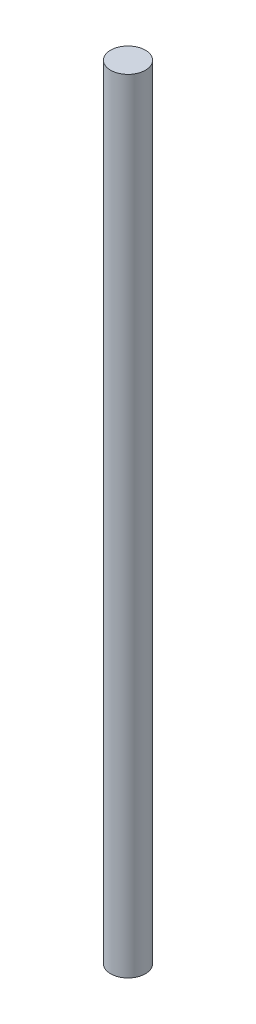
ISO-10303-21;
HEADER;
FILE_DESCRIPTION(('STEP AP214'),'2;1');
FILE_NAME('part.step','',(''),(''),'','','');
FILE_SCHEMA(('AUTOMOTIVE_DESIGN { 1 0 10303 214 1 1 1 1 }'));
ENDSEC;
DATA;
#1=APPLICATION_CONTEXT('core data for automotive mechanical design processes');
#2=APPLICATION_PROTOCOL_DEFINITION('international standard','automotive_design',2000,#1);
#3=PRODUCT_CONTEXT('',#1,'mechanical');
#4=PRODUCT('Part','Part','',(#3));
#5=PRODUCT_RELATED_PRODUCT_CATEGORY('part','',(#4));
#6=PRODUCT_DEFINITION_FORMATION('','',#4);
#7=PRODUCT_DEFINITION_CONTEXT('part definition',#1,'design');
#8=PRODUCT_DEFINITION('design','',#6,#7);
#9=PRODUCT_DEFINITION_SHAPE('','',#8);
#10=(LENGTH_UNIT() NAMED_UNIT(*) SI_UNIT(.MILLI.,.METRE.));
#11=(NAMED_UNIT(*) PLANE_ANGLE_UNIT() SI_UNIT($,.RADIAN.));
#12=(NAMED_UNIT(*) SI_UNIT($,.STERADIAN.) SOLID_ANGLE_UNIT());
#13=UNCERTAINTY_MEASURE_WITH_UNIT(LENGTH_MEASURE(1.E-05),#10,'distance_accuracy_value','');
#14=(GEOMETRIC_REPRESENTATION_CONTEXT(3) GLOBAL_UNCERTAINTY_ASSIGNED_CONTEXT((#13)) GLOBAL_UNIT_ASSIGNED_CONTEXT((#10,
#11,#12)) REPRESENTATION_CONTEXT('',''));
#15=CARTESIAN_POINT('',(0.,0.,0.));
#16=DIRECTION('',(0.,0.,1.));
#17=DIRECTION('',(1.,0.,0.));
#18=AXIS2_PLACEMENT_3D('',#15,#16,#17);
#19=CARTESIAN_POINT('',(0.,45.,0.));
#20=DIRECTION('',(0.,-1.,0.));
#21=DIRECTION('',(0.,0.,-1.));
#22=AXIS2_PLACEMENT_3D('',#19,#20,#21);
#23=CYLINDRICAL_SURFACE('',#22,1.);
#24=CARTESIAN_POINT('',(0.,45.,0.));
#25=DIRECTION('',(0.,1.,0.));
#26=DIRECTION('',(0.,0.,1.));
#27=AXIS2_PLACEMENT_3D('',#24,#25,#26);
#28=CIRCLE('',#27,1.);
#29=CARTESIAN_POINT('',(0.,45.,-1.));
#30=VERTEX_POINT('',#29);
#31=EDGE_CURVE('E10',#30,#30,#28,.T.);
#32=CARTESIAN_POINT('',(0.,0.,0.));
#33=DIRECTION('',(0.,1.,0.));
#34=DIRECTION('',(0.,0.,1.));
#35=AXIS2_PLACEMENT_3D('',#32,#33,#34);
#36=CIRCLE('',#35,1.);
#37=CARTESIAN_POINT('',(0.,0.,-1.));
#38=VERTEX_POINT('',#37);
#39=EDGE_CURVE('E42',#38,#38,#36,.T.);
#40=CARTESIAN_POINT('',(0.,45.,-1.));
#41=CARTESIAN_POINT('',(0.,44.53125,-1.));
#42=CARTESIAN_POINT('',(0.,44.0625,-1.));
#43=CARTESIAN_POINT('',(0.,43.125,-1.));
#44=CARTESIAN_POINT('',(0.,42.65625,-1.));
#45=CARTESIAN_POINT('',(0.,41.71875,-1.));
#46=CARTESIAN_POINT('',(0.,41.25,-1.));
#47=CARTESIAN_POINT('',(0.,40.3125,-1.));
#48=CARTESIAN_POINT('',(0.,39.84375,-1.));
#49=CARTESIAN_POINT('',(0.,38.90625,-1.));
#50=CARTESIAN_POINT('',(0.,38.4375,-1.));
#51=CARTESIAN_POINT('',(0.,37.5,-1.));
#52=CARTESIAN_POINT('',(0.,37.03125,-1.));
#53=CARTESIAN_POINT('',(0.,36.09375,-1.));
#54=CARTESIAN_POINT('',(0.,35.625,-1.));
#55=CARTESIAN_POINT('',(0.,34.6875,-1.));
#56=CARTESIAN_POINT('',(0.,34.21875,-1.));
#57=CARTESIAN_POINT('',(0.,33.28125,-1.));
#58=CARTESIAN_POINT('',(0.,32.8125,-1.));
#59=CARTESIAN_POINT('',(0.,31.875,-1.));
#60=CARTESIAN_POINT('',(0.,31.40625,-1.));
#61=CARTESIAN_POINT('',(0.,30.46875,-1.));
#62=CARTESIAN_POINT('',(0.,30.,-1.));
#63=CARTESIAN_POINT('',(0.,29.0625,-1.));
#64=CARTESIAN_POINT('',(0.,28.59375,-1.));
#65=CARTESIAN_POINT('',(0.,27.65625,-1.));
#66=CARTESIAN_POINT('',(0.,27.1875,-1.));
#67=CARTESIAN_POINT('',(0.,26.25,-1.));
#68=CARTESIAN_POINT('',(0.,25.78125,-1.));
#69=CARTESIAN_POINT('',(0.,24.84375,-1.));
#70=CARTESIAN_POINT('',(0.,24.375,-1.));
#71=CARTESIAN_POINT('',(0.,23.4375,-1.));
#72=CARTESIAN_POINT('',(0.,22.96875,-1.));
#73=CARTESIAN_POINT('',(0.,22.03125,-1.));
#74=CARTESIAN_POINT('',(0.,21.5625,-1.));
#75=CARTESIAN_POINT('',(0.,20.625,-1.));
#76=CARTESIAN_POINT('',(0.,20.15625,-1.));
#77=CARTESIAN_POINT('',(0.,19.21875,-1.));
#78=CARTESIAN_POINT('',(0.,18.75,-1.));
#79=CARTESIAN_POINT('',(0.,17.8125,-1.));
#80=CARTESIAN_POINT('',(0.,17.34375,-1.));
#81=CARTESIAN_POINT('',(0.,16.40625,-1.));
#82=CARTESIAN_POINT('',(0.,15.9375,-1.));
#83=CARTESIAN_POINT('',(0.,15.,-1.));
#84=CARTESIAN_POINT('',(0.,14.53125,-1.));
#85=CARTESIAN_POINT('',(0.,13.59375,-1.));
#86=CARTESIAN_POINT('',(0.,13.125,-1.));
#87=CARTESIAN_POINT('',(0.,12.1875,-1.));
#88=CARTESIAN_POINT('',(0.,11.71875,-1.));
#89=CARTESIAN_POINT('',(0.,10.78125,-1.));
#90=CARTESIAN_POINT('',(0.,10.3125,-1.));
#91=CARTESIAN_POINT('',(0.,9.37499999999999,-1.));
#92=CARTESIAN_POINT('',(0.,8.90624999999999,-1.));
#93=CARTESIAN_POINT('',(0.,7.96874999999999,-1.));
#94=CARTESIAN_POINT('',(0.,7.5,-1.));
#95=CARTESIAN_POINT('',(0.,6.56249999999999,-1.));
#96=CARTESIAN_POINT('',(0.,6.09374999999999,-1.));
#97=CARTESIAN_POINT('',(0.,5.15624999999999,-1.));
#98=CARTESIAN_POINT('',(0.,4.68749999999999,-1.));
#99=CARTESIAN_POINT('',(0.,3.74999999999999,-1.));
#100=CARTESIAN_POINT('',(0.,3.28124999999999,-1.));
#101=CARTESIAN_POINT('',(0.,2.34374999999999,-1.));
#102=CARTESIAN_POINT('',(0.,1.87499999999999,-1.));
#103=CARTESIAN_POINT('',(0.,0.937499999999992,-1.));
#104=CARTESIAN_POINT('',(0.,0.468749999999993,-1.));
#105=CARTESIAN_POINT('',(0.,0.,-1.));
#106=B_SPLINE_CURVE_WITH_KNOTS('',3,(#40,#41,#42,#43,#44,#45,#46,#47,#48,#49,#50,#51,#52,#53,
#54,#55,#56,#57,#58,#59,#60,#61,#62,#63,#64,#65,#66,#67,#68,#69,#70,#71,#72,#73,#74,#75,#76,#77,
#78,#79,#80,#81,#82,#83,#84,#85,#86,#87,#88,#89,#90,#91,#92,#93,#94,#95,#96,#97,#98,#99,#100,
#101,#102,#103,#104,#105),.UNSPECIFIED.,.F.,.F.,(4,2,2,2,2,2,2,2,2,2,2,2,2,2,2,2,2,2,2,2,2,2,2,
2,2,2,2,2,2,2,2,2,4),(0.,1.40625,2.8125,4.21874999999999,5.625,7.03125,8.43749999999999,9.84375,
11.25,12.65625,14.0625,15.46875,16.875,18.28125,19.6875,21.09375,22.5,23.90625,25.3125,26.71875,
28.125,29.53125,30.9375,32.34375,33.75,35.15625,36.5625,37.96875,39.375,40.78125,42.1875,
43.59375,45.),.UNSPECIFIED.);
#107=EDGE_CURVE('BSEAM39',#30,#38,#106,.T.);
#108=ORIENTED_EDGE('',*,*,#31,.F.);
#109=ORIENTED_EDGE('',*,*,#39,.T.);
#110=ORIENTED_EDGE('',*,*,#107,.T.);
#111=ORIENTED_EDGE('',*,*,#107,.F.);
#112=EDGE_LOOP('',(#108,#110,#109,#111));
#113=FACE_BOUND('',#112,.T.);
#114=ADVANCED_FACE('F39',(#113),#23,.T.);
#115=CARTESIAN_POINT('',(0.,45.,0.));
#116=DIRECTION('',(0.,1.,0.));
#117=DIRECTION('',(0.,0.,1.));
#118=AXIS2_PLACEMENT_3D('',#115,#116,#117);
#119=PLANE('',#118);
#120=ORIENTED_EDGE('',*,*,#31,.T.);
#121=EDGE_LOOP('',(#120));
#122=FACE_BOUND('',#121,.T.);
#123=ADVANCED_FACE('F54',(#122),#119,.T.);
#124=CARTESIAN_POINT('',(0.,0.,0.));
#125=DIRECTION('',(0.,1.,0.));
#126=DIRECTION('',(0.,0.,1.));
#127=AXIS2_PLACEMENT_3D('',#124,#125,#126);
#128=PLANE('',#127);
#129=ORIENTED_EDGE('',*,*,#39,.F.);
#130=EDGE_LOOP('',(#129));
#131=FACE_BOUND('',#130,.T.);
#132=ADVANCED_FACE('F52',(#131),#128,.F.);
#133=CLOSED_SHELL('',(#114,#123,#132));
#134=MANIFOLD_SOLID_BREP('B2',#133);
#135=ADVANCED_BREP_SHAPE_REPRESENTATION('',(#18,#134),#14);
#136=SHAPE_DEFINITION_REPRESENTATION(#9,#135);
ENDSEC;
END-ISO-10303-21;
